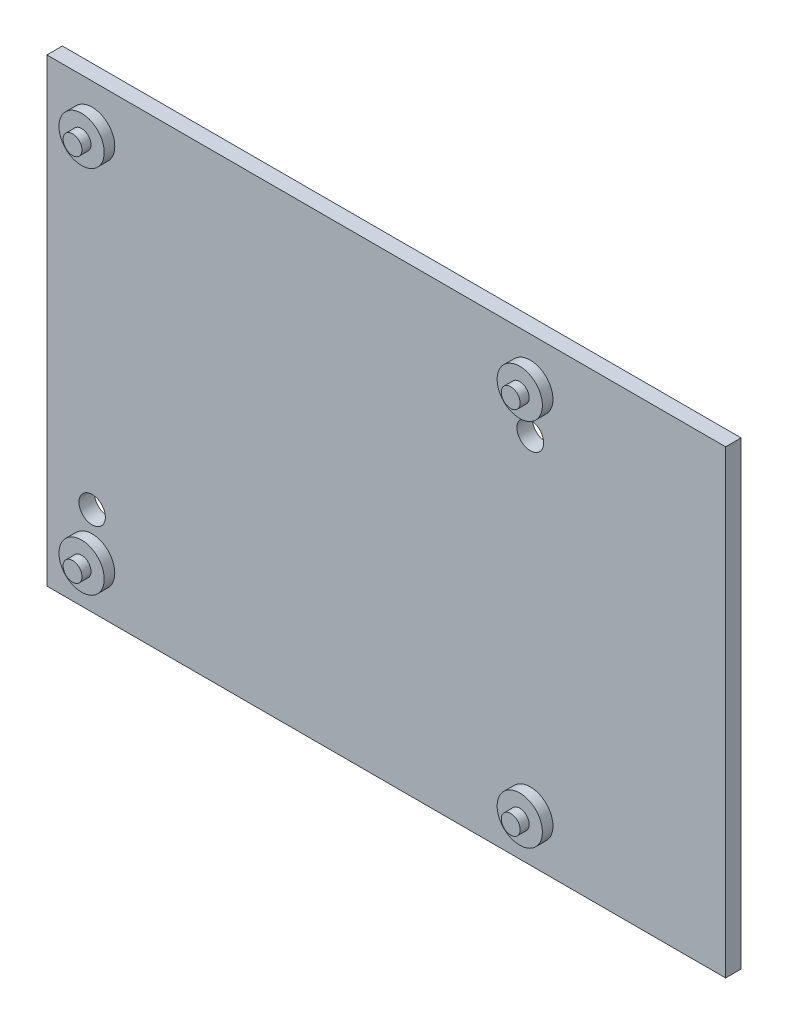
ISO-10303-21;
HEADER;
FILE_DESCRIPTION(('STEP AP214'),'2;1');
FILE_NAME('part.step','',(''),(''),'','','');
FILE_SCHEMA(('AUTOMOTIVE_DESIGN { 1 0 10303 214 1 1 1 1 }'));
ENDSEC;
DATA;
#1=APPLICATION_CONTEXT('core data for automotive mechanical design processes');
#2=APPLICATION_PROTOCOL_DEFINITION('international standard','automotive_design',2000,#1);
#3=PRODUCT_CONTEXT('',#1,'mechanical');
#4=PRODUCT('Part','Part','',(#3));
#5=PRODUCT_RELATED_PRODUCT_CATEGORY('part','',(#4));
#6=PRODUCT_DEFINITION_FORMATION('','',#4);
#7=PRODUCT_DEFINITION_CONTEXT('part definition',#1,'design');
#8=PRODUCT_DEFINITION('design','',#6,#7);
#9=PRODUCT_DEFINITION_SHAPE('','',#8);
#10=(LENGTH_UNIT() NAMED_UNIT(*) SI_UNIT(.MILLI.,.METRE.));
#11=(NAMED_UNIT(*) PLANE_ANGLE_UNIT() SI_UNIT($,.RADIAN.));
#12=(NAMED_UNIT(*) SI_UNIT($,.STERADIAN.) SOLID_ANGLE_UNIT());
#13=UNCERTAINTY_MEASURE_WITH_UNIT(LENGTH_MEASURE(1.E-05),#10,'distance_accuracy_value','');
#14=(GEOMETRIC_REPRESENTATION_CONTEXT(3) GLOBAL_UNCERTAINTY_ASSIGNED_CONTEXT((#13)) GLOBAL_UNIT_ASSIGNED_CONTEXT((#10,
#11,#12)) REPRESENTATION_CONTEXT('',''));
#15=CARTESIAN_POINT('',(0.,0.,0.));
#16=DIRECTION('',(0.,0.,1.));
#17=DIRECTION('',(1.,0.,0.));
#18=AXIS2_PLACEMENT_3D('',#15,#16,#17);
#19=CARTESIAN_POINT('',(45.,-30.5,-2.05));
#20=DIRECTION('',(1.,0.,0.));
#21=DIRECTION('',(0.,0.,-1.));
#22=AXIS2_PLACEMENT_3D('',#19,#20,#21);
#23=PLANE('',#22);
#24=DIRECTION('',(0.,1.,0.));
#25=VECTOR('',#24,1.);
#26=CARTESIAN_POINT('',(45.,-30.5,0.));
#27=LINE('',#26,#25);
#28=CARTESIAN_POINT('',(45.,-30.5,0.));
#29=VERTEX_POINT('',#28);
#30=CARTESIAN_POINT('',(45.,30.5,0.));
#31=VERTEX_POINT('',#30);
#32=EDGE_CURVE('E120',#29,#31,#27,.T.);
#33=ORIENTED_EDGE('',*,*,#32,.F.);
#34=DIRECTION('',(0.,0.,1.));
#35=VECTOR('',#34,1.);
#36=CARTESIAN_POINT('',(45.,-30.5,-2.05));
#37=LINE('',#36,#35);
#38=CARTESIAN_POINT('',(45.,-30.5,-2.05));
#39=VERTEX_POINT('',#38);
#40=EDGE_CURVE('E11',#39,#29,#37,.T.);
#41=ORIENTED_EDGE('',*,*,#40,.F.);
#42=DIRECTION('',(0.,1.,0.));
#43=VECTOR('',#42,1.);
#44=CARTESIAN_POINT('',(45.,-30.5,-2.05));
#45=LINE('',#44,#43);
#46=CARTESIAN_POINT('',(45.,30.5,-2.05));
#47=VERTEX_POINT('',#46);
#48=EDGE_CURVE('E112',#39,#47,#45,.T.);
#49=ORIENTED_EDGE('',*,*,#48,.T.);
#50=DIRECTION('',(0.,0.,1.));
#51=VECTOR('',#50,1.);
#52=CARTESIAN_POINT('',(45.,30.5,-2.05));
#53=LINE('',#52,#51);
#54=EDGE_CURVE('E93',#47,#31,#53,.T.);
#55=ORIENTED_EDGE('',*,*,#54,.T.);
#56=EDGE_LOOP('',(#33,#41,#49,#55));
#57=FACE_BOUND('',#56,.T.);
#58=ADVANCED_FACE('F50',(#57),#23,.T.);
#59=CARTESIAN_POINT('',(-45.,-30.5,-2.05));
#60=DIRECTION('',(0.,-1.,0.));
#61=DIRECTION('',(0.,0.,-1.));
#62=AXIS2_PLACEMENT_3D('',#59,#60,#61);
#63=PLANE('',#62);
#64=DIRECTION('',(1.,0.,0.));
#65=VECTOR('',#64,1.);
#66=CARTESIAN_POINT('',(-45.,-30.5,0.));
#67=LINE('',#66,#65);
#68=CARTESIAN_POINT('',(-45.,-30.5,0.));
#69=VERTEX_POINT('',#68);
#70=EDGE_CURVE('E111',#69,#29,#67,.T.);
#71=ORIENTED_EDGE('',*,*,#70,.F.);
#72=DIRECTION('',(0.,0.,1.));
#73=VECTOR('',#72,1.);
#74=CARTESIAN_POINT('',(-45.,-30.5,-2.05));
#75=LINE('',#74,#73);
#76=CARTESIAN_POINT('',(-45.,-30.5,-2.05));
#77=VERTEX_POINT('',#76);
#78=EDGE_CURVE('E60',#77,#69,#75,.T.);
#79=ORIENTED_EDGE('',*,*,#78,.F.);
#80=DIRECTION('',(1.,0.,0.));
#81=VECTOR('',#80,1.);
#82=CARTESIAN_POINT('',(-45.,-30.5,-2.05));
#83=LINE('',#82,#81);
#84=EDGE_CURVE('E106',#77,#39,#83,.T.);
#85=ORIENTED_EDGE('',*,*,#84,.T.);
#86=ORIENTED_EDGE('',*,*,#40,.T.);
#87=EDGE_LOOP('',(#71,#79,#85,#86));
#88=FACE_BOUND('',#87,.T.);
#89=ADVANCED_FACE('F240',(#88),#63,.T.);
#90=CARTESIAN_POINT('',(-45.,-30.5,-2.05));
#91=DIRECTION('',(-1.,0.,0.));
#92=DIRECTION('',(0.,0.,1.));
#93=AXIS2_PLACEMENT_3D('',#90,#91,#92);
#94=PLANE('',#93);
#95=DIRECTION('',(0.,-1.,0.));
#96=VECTOR('',#95,1.);
#97=CARTESIAN_POINT('',(-45.,-30.5,0.));
#98=LINE('',#97,#96);
#99=CARTESIAN_POINT('',(-45.,30.5,0.));
#100=VERTEX_POINT('',#99);
#101=EDGE_CURVE('E97',#100,#69,#98,.T.);
#102=ORIENTED_EDGE('',*,*,#101,.F.);
#103=DIRECTION('',(0.,0.,1.));
#104=VECTOR('',#103,1.);
#105=CARTESIAN_POINT('',(-45.,30.5,-2.05));
#106=LINE('',#105,#104);
#107=CARTESIAN_POINT('',(-45.,30.5,-2.05));
#108=VERTEX_POINT('',#107);
#109=EDGE_CURVE('E94',#108,#100,#106,.T.);
#110=ORIENTED_EDGE('',*,*,#109,.F.);
#111=DIRECTION('',(0.,-1.,0.));
#112=VECTOR('',#111,1.);
#113=CARTESIAN_POINT('',(-45.,-30.5,-2.05));
#114=LINE('',#113,#112);
#115=EDGE_CURVE('E100',#108,#77,#114,.T.);
#116=ORIENTED_EDGE('',*,*,#115,.T.);
#117=ORIENTED_EDGE('',*,*,#78,.T.);
#118=EDGE_LOOP('',(#102,#110,#116,#117));
#119=FACE_BOUND('',#118,.T.);
#120=ADVANCED_FACE('F96',(#119),#94,.T.);
#121=CARTESIAN_POINT('',(-45.,30.5,-2.05));
#122=DIRECTION('',(0.,1.,0.));
#123=DIRECTION('',(0.,0.,1.));
#124=AXIS2_PLACEMENT_3D('',#121,#122,#123);
#125=PLANE('',#124);
#126=DIRECTION('',(-1.,0.,0.));
#127=VECTOR('',#126,1.);
#128=CARTESIAN_POINT('',(-45.,30.5,0.));
#129=LINE('',#128,#127);
#130=EDGE_CURVE('E122',#31,#100,#129,.T.);
#131=ORIENTED_EDGE('',*,*,#130,.F.);
#132=ORIENTED_EDGE('',*,*,#54,.F.);
#133=DIRECTION('',(-1.,0.,0.));
#134=VECTOR('',#133,1.);
#135=CARTESIAN_POINT('',(-45.,30.5,-2.05));
#136=LINE('',#135,#134);
#137=EDGE_CURVE('E104',#47,#108,#136,.T.);
#138=ORIENTED_EDGE('',*,*,#137,.T.);
#139=ORIENTED_EDGE('',*,*,#109,.T.);
#140=EDGE_LOOP('',(#131,#132,#138,#139));
#141=FACE_BOUND('',#140,.T.);
#142=ADVANCED_FACE('F108',(#141),#125,.T.);
#143=CARTESIAN_POINT('',(0.,0.,-2.05));
#144=DIRECTION('',(0.,0.,-1.));
#145=DIRECTION('',(-1.,0.,0.));
#146=AXIS2_PLACEMENT_3D('',#143,#144,#145);
#147=PLANE('',#146);
#148=CARTESIAN_POINT('',(19.1,18.86871886,-2.05));
#149=DIRECTION('',(0.,0.,-1.));
#150=DIRECTION('',(-1.,0.,0.));
#151=AXIS2_PLACEMENT_3D('',#148,#149,#150);
#152=CIRCLE('',#151,1.775);
#153=CARTESIAN_POINT('',(17.325,18.86871886,-2.05));
#154=VERTEX_POINT('',#153);
#155=EDGE_CURVE('E164',#154,#154,#152,.T.);
#156=ORIENTED_EDGE('',*,*,#155,.F.);
#157=EDGE_LOOP('',(#156));
#158=FACE_BOUND('',#157,.T.);
#159=CARTESIAN_POINT('',(-39.,-18.72,-2.05));
#160=DIRECTION('',(0.,0.,-1.));
#161=DIRECTION('',(-1.,0.,0.));
#162=AXIS2_PLACEMENT_3D('',#159,#160,#161);
#163=CIRCLE('',#162,1.75);
#164=CARTESIAN_POINT('',(-40.75,-18.72,-2.05));
#165=VERTEX_POINT('',#164);
#166=EDGE_CURVE('E154',#165,#165,#163,.T.);
#167=ORIENTED_EDGE('',*,*,#166,.F.);
#168=EDGE_LOOP('',(#167));
#169=FACE_BOUND('',#168,.T.);
#170=ORIENTED_EDGE('',*,*,#48,.F.);
#171=ORIENTED_EDGE('',*,*,#84,.F.);
#172=ORIENTED_EDGE('',*,*,#115,.F.);
#173=ORIENTED_EDGE('',*,*,#137,.F.);
#174=EDGE_LOOP('',(#170,#171,#172,#173));
#175=FACE_BOUND('',#174,.T.);
#176=ADVANCED_FACE('F102',(#158,#169,#175),#147,.T.);
#177=CARTESIAN_POINT('',(0.,0.,0.));
#178=DIRECTION('',(0.,0.,-1.));
#179=DIRECTION('',(-1.,0.,0.));
#180=AXIS2_PLACEMENT_3D('',#177,#178,#179);
#181=PLANE('',#180);
#182=CARTESIAN_POINT('',(19.1,18.86871886,0.));
#183=DIRECTION('',(0.,0.,-1.));
#184=DIRECTION('',(-1.,0.,0.));
#185=AXIS2_PLACEMENT_3D('',#182,#183,#184);
#186=CIRCLE('',#185,1.775);
#187=CARTESIAN_POINT('',(17.325,18.86871886,0.));
#188=VERTEX_POINT('',#187);
#189=EDGE_CURVE('E49',#188,#188,#186,.T.);
#190=ORIENTED_EDGE('',*,*,#189,.T.);
#191=EDGE_LOOP('',(#190));
#192=FACE_BOUND('',#191,.T.);
#193=CARTESIAN_POINT('',(-39.,-18.72,0.));
#194=DIRECTION('',(0.,0.,-1.));
#195=DIRECTION('',(-1.,0.,0.));
#196=AXIS2_PLACEMENT_3D('',#193,#194,#195);
#197=CIRCLE('',#196,1.75);
#198=CARTESIAN_POINT('',(-40.75,-18.72,0.));
#199=VERTEX_POINT('',#198);
#200=EDGE_CURVE('E155',#199,#199,#197,.T.);
#201=ORIENTED_EDGE('',*,*,#200,.T.);
#202=EDGE_LOOP('',(#201));
#203=FACE_BOUND('',#202,.T.);
#204=CARTESIAN_POINT('',(-39.,-24.5,0.));
#205=DIRECTION('',(0.,0.,-1.));
#206=DIRECTION('',(-1.,0.,0.));
#207=AXIS2_PLACEMENT_3D('',#204,#205,#206);
#208=CIRCLE('',#207,3.);
#209=CARTESIAN_POINT('',(-42.,-24.5,0.));
#210=VERTEX_POINT('',#209);
#211=EDGE_CURVE('E124',#210,#210,#208,.T.);
#212=ORIENTED_EDGE('',*,*,#211,.T.);
#213=EDGE_LOOP('',(#212));
#214=FACE_BOUND('',#213,.T.);
#215=CARTESIAN_POINT('',(19.1,-24.5,0.));
#216=DIRECTION('',(0.,0.,-1.));
#217=DIRECTION('',(-1.,0.,0.));
#218=AXIS2_PLACEMENT_3D('',#215,#216,#217);
#219=CIRCLE('',#218,3.);
#220=CARTESIAN_POINT('',(16.1,-24.5,0.));
#221=VERTEX_POINT('',#220);
#222=EDGE_CURVE('E148',#221,#221,#219,.T.);
#223=ORIENTED_EDGE('',*,*,#222,.T.);
#224=EDGE_LOOP('',(#223));
#225=FACE_BOUND('',#224,.T.);
#226=CARTESIAN_POINT('',(19.1,24.5,0.));
#227=DIRECTION('',(0.,0.,-1.));
#228=DIRECTION('',(-1.,0.,0.));
#229=AXIS2_PLACEMENT_3D('',#226,#227,#228);
#230=CIRCLE('',#229,3.);
#231=CARTESIAN_POINT('',(16.1,24.5,0.));
#232=VERTEX_POINT('',#231);
#233=EDGE_CURVE('E143',#232,#232,#230,.T.);
#234=ORIENTED_EDGE('',*,*,#233,.T.);
#235=EDGE_LOOP('',(#234));
#236=FACE_BOUND('',#235,.T.);
#237=CARTESIAN_POINT('',(-39.,24.5,0.));
#238=DIRECTION('',(0.,0.,-1.));
#239=DIRECTION('',(-1.,0.,0.));
#240=AXIS2_PLACEMENT_3D('',#237,#238,#239);
#241=CIRCLE('',#240,3.);
#242=CARTESIAN_POINT('',(-42.,24.5,0.));
#243=VERTEX_POINT('',#242);
#244=EDGE_CURVE('E140',#243,#243,#241,.T.);
#245=ORIENTED_EDGE('',*,*,#244,.T.);
#246=EDGE_LOOP('',(#245));
#247=FACE_BOUND('',#246,.T.);
#248=ORIENTED_EDGE('',*,*,#32,.T.);
#249=ORIENTED_EDGE('',*,*,#130,.T.);
#250=ORIENTED_EDGE('',*,*,#101,.T.);
#251=ORIENTED_EDGE('',*,*,#70,.T.);
#252=EDGE_LOOP('',(#248,#249,#250,#251));
#253=FACE_BOUND('',#252,.T.);
#254=ADVANCED_FACE('F228',(#192,#203,#214,#225,#236,#247,#253),#181,.F.);
#255=CARTESIAN_POINT('',(-39.,24.5,-0.5));
#256=DIRECTION('',(0.,0.,1.));
#257=DIRECTION('',(1.,0.,0.));
#258=AXIS2_PLACEMENT_3D('',#255,#256,#257);
#259=CYLINDRICAL_SURFACE('',#258,3.);
#260=CARTESIAN_POINT('',(-39.,24.5,1.4));
#261=DIRECTION('',(0.,0.,1.));
#262=DIRECTION('',(1.,0.,0.));
#263=AXIS2_PLACEMENT_3D('',#260,#261,#262);
#264=CIRCLE('',#263,3.);
#265=CARTESIAN_POINT('',(-36.,24.5,1.4));
#266=VERTEX_POINT('',#265);
#267=EDGE_CURVE('E209',#266,#266,#264,.T.);
#268=ORIENTED_EDGE('',*,*,#267,.F.);
#269=EDGE_LOOP('',(#268));
#270=FACE_BOUND('',#269,.T.);
#271=ORIENTED_EDGE('',*,*,#244,.F.);
#272=EDGE_LOOP('',(#271));
#273=FACE_BOUND('',#272,.T.);
#274=ADVANCED_FACE('F224',(#270,#273),#259,.T.);
#275=CARTESIAN_POINT('',(-39.,24.5,1.4));
#276=DIRECTION('',(0.,0.,1.));
#277=DIRECTION('',(1.,0.,0.));
#278=AXIS2_PLACEMENT_3D('',#275,#276,#277);
#279=PLANE('',#278);
#280=CARTESIAN_POINT('',(-39.,24.5,1.4));
#281=DIRECTION('',(0.,0.,1.));
#282=DIRECTION('',(1.,0.,0.));
#283=AXIS2_PLACEMENT_3D('',#280,#281,#282);
#284=CIRCLE('',#283,1.25);
#285=CARTESIAN_POINT('',(-37.75,24.5,1.4));
#286=VERTEX_POINT('',#285);
#287=EDGE_CURVE('E142',#286,#286,#284,.T.);
#288=ORIENTED_EDGE('',*,*,#287,.F.);
#289=EDGE_LOOP('',(#288));
#290=FACE_BOUND('',#289,.T.);
#291=ORIENTED_EDGE('',*,*,#267,.T.);
#292=EDGE_LOOP('',(#291));
#293=FACE_BOUND('',#292,.T.);
#294=ADVANCED_FACE('F219',(#290,#293),#279,.T.);
#295=CARTESIAN_POINT('',(-39.,24.5,-0.5));
#296=DIRECTION('',(0.,0.,1.));
#297=DIRECTION('',(1.,0.,0.));
#298=AXIS2_PLACEMENT_3D('',#295,#296,#297);
#299=CYLINDRICAL_SURFACE('',#298,1.25);
#300=ORIENTED_EDGE('',*,*,#287,.T.);
#301=EDGE_LOOP('',(#300));
#302=FACE_BOUND('',#301,.T.);
#303=CARTESIAN_POINT('',(-39.,24.5,2.6));
#304=DIRECTION('',(0.,0.,1.));
#305=DIRECTION('',(1.,0.,0.));
#306=AXIS2_PLACEMENT_3D('',#303,#304,#305);
#307=CIRCLE('',#306,1.25);
#308=CARTESIAN_POINT('',(-37.75,24.5,2.6));
#309=VERTEX_POINT('',#308);
#310=EDGE_CURVE('E184',#309,#309,#307,.T.);
#311=ORIENTED_EDGE('',*,*,#310,.F.);
#312=EDGE_LOOP('',(#311));
#313=FACE_BOUND('',#312,.T.);
#314=ADVANCED_FACE('F220',(#302,#313),#299,.T.);
#315=CARTESIAN_POINT('',(-39.,24.5,2.6));
#316=DIRECTION('',(0.,0.,1.));
#317=DIRECTION('',(1.,0.,0.));
#318=AXIS2_PLACEMENT_3D('',#315,#316,#317);
#319=PLANE('',#318);
#320=ORIENTED_EDGE('',*,*,#310,.T.);
#321=EDGE_LOOP('',(#320));
#322=FACE_BOUND('',#321,.T.);
#323=ADVANCED_FACE('F257',(#322),#319,.T.);
#324=CARTESIAN_POINT('',(19.1,24.5,-0.5));
#325=DIRECTION('',(0.,0.,1.));
#326=DIRECTION('',(1.,0.,0.));
#327=AXIS2_PLACEMENT_3D('',#324,#325,#326);
#328=CYLINDRICAL_SURFACE('',#327,3.);
#329=CARTESIAN_POINT('',(19.1,24.5,1.4));
#330=DIRECTION('',(0.,0.,1.));
#331=DIRECTION('',(1.,0.,0.));
#332=AXIS2_PLACEMENT_3D('',#329,#330,#331);
#333=CIRCLE('',#332,3.);
#334=CARTESIAN_POINT('',(22.1,24.5,1.4));
#335=VERTEX_POINT('',#334);
#336=EDGE_CURVE('E175',#335,#335,#333,.T.);
#337=ORIENTED_EDGE('',*,*,#336,.F.);
#338=EDGE_LOOP('',(#337));
#339=FACE_BOUND('',#338,.T.);
#340=ORIENTED_EDGE('',*,*,#233,.F.);
#341=EDGE_LOOP('',(#340));
#342=FACE_BOUND('',#341,.T.);
#343=ADVANCED_FACE('F263',(#339,#342),#328,.T.);
#344=CARTESIAN_POINT('',(19.1,24.5,1.4));
#345=DIRECTION('',(0.,0.,1.));
#346=DIRECTION('',(1.,0.,0.));
#347=AXIS2_PLACEMENT_3D('',#344,#345,#346);
#348=PLANE('',#347);
#349=CARTESIAN_POINT('',(19.1,24.5,1.4));
#350=DIRECTION('',(0.,0.,1.));
#351=DIRECTION('',(1.,0.,0.));
#352=AXIS2_PLACEMENT_3D('',#349,#350,#351);
#353=CIRCLE('',#352,1.25);
#354=CARTESIAN_POINT('',(20.35,24.5,1.4));
#355=VERTEX_POINT('',#354);
#356=EDGE_CURVE('E179',#355,#355,#353,.T.);
#357=ORIENTED_EDGE('',*,*,#356,.F.);
#358=EDGE_LOOP('',(#357));
#359=FACE_BOUND('',#358,.T.);
#360=ORIENTED_EDGE('',*,*,#336,.T.);
#361=EDGE_LOOP('',(#360));
#362=FACE_BOUND('',#361,.T.);
#363=ADVANCED_FACE('F298',(#359,#362),#348,.T.);
#364=CARTESIAN_POINT('',(19.1,24.5,-0.5));
#365=DIRECTION('',(0.,0.,1.));
#366=DIRECTION('',(1.,0.,0.));
#367=AXIS2_PLACEMENT_3D('',#364,#365,#366);
#368=CYLINDRICAL_SURFACE('',#367,1.25);
#369=ORIENTED_EDGE('',*,*,#356,.T.);
#370=EDGE_LOOP('',(#369));
#371=FACE_BOUND('',#370,.T.);
#372=CARTESIAN_POINT('',(19.1,24.5,2.6));
#373=DIRECTION('',(0.,0.,1.));
#374=DIRECTION('',(1.,0.,0.));
#375=AXIS2_PLACEMENT_3D('',#372,#373,#374);
#376=CIRCLE('',#375,1.25);
#377=CARTESIAN_POINT('',(20.35,24.5,2.6));
#378=VERTEX_POINT('',#377);
#379=EDGE_CURVE('E171',#378,#378,#376,.T.);
#380=ORIENTED_EDGE('',*,*,#379,.F.);
#381=EDGE_LOOP('',(#380));
#382=FACE_BOUND('',#381,.T.);
#383=ADVANCED_FACE('F305',(#371,#382),#368,.T.);
#384=CARTESIAN_POINT('',(19.1,24.5,2.6));
#385=DIRECTION('',(0.,0.,1.));
#386=DIRECTION('',(1.,0.,0.));
#387=AXIS2_PLACEMENT_3D('',#384,#385,#386);
#388=PLANE('',#387);
#389=ORIENTED_EDGE('',*,*,#379,.T.);
#390=EDGE_LOOP('',(#389));
#391=FACE_BOUND('',#390,.T.);
#392=ADVANCED_FACE('F292',(#391),#388,.T.);
#393=CARTESIAN_POINT('',(19.1,-24.5,-0.5));
#394=DIRECTION('',(0.,0.,1.));
#395=DIRECTION('',(1.,0.,0.));
#396=AXIS2_PLACEMENT_3D('',#393,#394,#395);
#397=CYLINDRICAL_SURFACE('',#396,3.);
#398=CARTESIAN_POINT('',(19.1,-24.5,1.4));
#399=DIRECTION('',(0.,0.,1.));
#400=DIRECTION('',(1.,0.,0.));
#401=AXIS2_PLACEMENT_3D('',#398,#399,#400);
#402=CIRCLE('',#401,3.);
#403=CARTESIAN_POINT('',(22.1,-24.5,1.4));
#404=VERTEX_POINT('',#403);
#405=EDGE_CURVE('E188',#404,#404,#402,.T.);
#406=ORIENTED_EDGE('',*,*,#405,.F.);
#407=EDGE_LOOP('',(#406));
#408=FACE_BOUND('',#407,.T.);
#409=ORIENTED_EDGE('',*,*,#222,.F.);
#410=EDGE_LOOP('',(#409));
#411=FACE_BOUND('',#410,.T.);
#412=ADVANCED_FACE('F290',(#408,#411),#397,.T.);
#413=CARTESIAN_POINT('',(19.1,-24.5,1.4));
#414=DIRECTION('',(0.,0.,1.));
#415=DIRECTION('',(1.,0.,0.));
#416=AXIS2_PLACEMENT_3D('',#413,#414,#415);
#417=PLANE('',#416);
#418=CARTESIAN_POINT('',(19.1,-24.5,1.4));
#419=DIRECTION('',(0.,0.,1.));
#420=DIRECTION('',(1.,0.,0.));
#421=AXIS2_PLACEMENT_3D('',#418,#419,#420);
#422=CIRCLE('',#421,1.25);
#423=CARTESIAN_POINT('',(20.35,-24.5,1.4));
#424=VERTEX_POINT('',#423);
#425=EDGE_CURVE('E176',#424,#424,#422,.T.);
#426=ORIENTED_EDGE('',*,*,#425,.F.);
#427=EDGE_LOOP('',(#426));
#428=FACE_BOUND('',#427,.T.);
#429=ORIENTED_EDGE('',*,*,#405,.T.);
#430=EDGE_LOOP('',(#429));
#431=FACE_BOUND('',#430,.T.);
#432=ADVANCED_FACE('F284',(#428,#431),#417,.T.);
#433=CARTESIAN_POINT('',(19.1,-24.5,-0.5));
#434=DIRECTION('',(0.,0.,1.));
#435=DIRECTION('',(1.,0.,0.));
#436=AXIS2_PLACEMENT_3D('',#433,#434,#435);
#437=CYLINDRICAL_SURFACE('',#436,1.25);
#438=ORIENTED_EDGE('',*,*,#425,.T.);
#439=EDGE_LOOP('',(#438));
#440=FACE_BOUND('',#439,.T.);
#441=CARTESIAN_POINT('',(19.1,-24.5,2.6));
#442=DIRECTION('',(0.,0.,1.));
#443=DIRECTION('',(1.,0.,0.));
#444=AXIS2_PLACEMENT_3D('',#441,#442,#443);
#445=CIRCLE('',#444,1.25);
#446=CARTESIAN_POINT('',(20.35,-24.5,2.6));
#447=VERTEX_POINT('',#446);
#448=EDGE_CURVE('E183',#447,#447,#445,.T.);
#449=ORIENTED_EDGE('',*,*,#448,.F.);
#450=EDGE_LOOP('',(#449));
#451=FACE_BOUND('',#450,.T.);
#452=ADVANCED_FACE('F286',(#440,#451),#437,.T.);
#453=CARTESIAN_POINT('',(19.1,-24.5,2.6));
#454=DIRECTION('',(0.,0.,1.));
#455=DIRECTION('',(1.,0.,0.));
#456=AXIS2_PLACEMENT_3D('',#453,#454,#455);
#457=PLANE('',#456);
#458=ORIENTED_EDGE('',*,*,#448,.T.);
#459=EDGE_LOOP('',(#458));
#460=FACE_BOUND('',#459,.T.);
#461=ADVANCED_FACE('F272',(#460),#457,.T.);
#462=CARTESIAN_POINT('',(-39.,-24.5,-0.5));
#463=DIRECTION('',(0.,0.,1.));
#464=DIRECTION('',(1.,0.,0.));
#465=AXIS2_PLACEMENT_3D('',#462,#463,#464);
#466=CYLINDRICAL_SURFACE('',#465,3.);
#467=CARTESIAN_POINT('',(-39.,-24.5,1.4));
#468=DIRECTION('',(0.,0.,1.));
#469=DIRECTION('',(1.,0.,0.));
#470=AXIS2_PLACEMENT_3D('',#467,#468,#469);
#471=CIRCLE('',#470,3.);
#472=CARTESIAN_POINT('',(-36.,-24.5,1.4));
#473=VERTEX_POINT('',#472);
#474=EDGE_CURVE('E199',#473,#473,#471,.T.);
#475=ORIENTED_EDGE('',*,*,#474,.F.);
#476=EDGE_LOOP('',(#475));
#477=FACE_BOUND('',#476,.T.);
#478=ORIENTED_EDGE('',*,*,#211,.F.);
#479=EDGE_LOOP('',(#478));
#480=FACE_BOUND('',#479,.T.);
#481=ADVANCED_FACE('F267',(#477,#480),#466,.T.);
#482=CARTESIAN_POINT('',(-39.,-24.5,1.4));
#483=DIRECTION('',(0.,0.,1.));
#484=DIRECTION('',(1.,0.,0.));
#485=AXIS2_PLACEMENT_3D('',#482,#483,#484);
#486=PLANE('',#485);
#487=CARTESIAN_POINT('',(-39.,-24.5,1.4));
#488=DIRECTION('',(0.,0.,1.));
#489=DIRECTION('',(1.,0.,0.));
#490=AXIS2_PLACEMENT_3D('',#487,#488,#489);
#491=CIRCLE('',#490,1.25);
#492=CARTESIAN_POINT('',(-37.75,-24.5,1.4));
#493=VERTEX_POINT('',#492);
#494=EDGE_CURVE('E190',#493,#493,#491,.T.);
#495=ORIENTED_EDGE('',*,*,#494,.F.);
#496=EDGE_LOOP('',(#495));
#497=FACE_BOUND('',#496,.T.);
#498=ORIENTED_EDGE('',*,*,#474,.T.);
#499=EDGE_LOOP('',(#498));
#500=FACE_BOUND('',#499,.T.);
#501=ADVANCED_FACE('F264',(#497,#500),#486,.T.);
#502=CARTESIAN_POINT('',(-39.,-24.5,-0.5));
#503=DIRECTION('',(0.,0.,1.));
#504=DIRECTION('',(1.,0.,0.));
#505=AXIS2_PLACEMENT_3D('',#502,#503,#504);
#506=CYLINDRICAL_SURFACE('',#505,1.25);
#507=ORIENTED_EDGE('',*,*,#494,.T.);
#508=EDGE_LOOP('',(#507));
#509=FACE_BOUND('',#508,.T.);
#510=CARTESIAN_POINT('',(-39.,-24.5,2.6));
#511=DIRECTION('',(0.,0.,1.));
#512=DIRECTION('',(1.,0.,0.));
#513=AXIS2_PLACEMENT_3D('',#510,#511,#512);
#514=CIRCLE('',#513,1.25);
#515=CARTESIAN_POINT('',(-37.75,-24.5,2.6));
#516=VERTEX_POINT('',#515);
#517=EDGE_CURVE('E168',#516,#516,#514,.T.);
#518=ORIENTED_EDGE('',*,*,#517,.F.);
#519=EDGE_LOOP('',(#518));
#520=FACE_BOUND('',#519,.T.);
#521=ADVANCED_FACE('F268',(#509,#520),#506,.T.);
#522=CARTESIAN_POINT('',(-39.,-24.5,2.6));
#523=DIRECTION('',(0.,0.,1.));
#524=DIRECTION('',(1.,0.,0.));
#525=AXIS2_PLACEMENT_3D('',#522,#523,#524);
#526=PLANE('',#525);
#527=ORIENTED_EDGE('',*,*,#517,.T.);
#528=EDGE_LOOP('',(#527));
#529=FACE_BOUND('',#528,.T.);
#530=ADVANCED_FACE('F274',(#529),#526,.T.);
#531=CARTESIAN_POINT('',(-39.,-18.72,-5.));
#532=DIRECTION('',(0.,0.,1.));
#533=DIRECTION('',(1.,0.,0.));
#534=AXIS2_PLACEMENT_3D('',#531,#532,#533);
#535=CYLINDRICAL_SURFACE('',#534,1.75);
#536=ORIENTED_EDGE('',*,*,#166,.T.);
#537=EDGE_LOOP('',(#536));
#538=FACE_BOUND('',#537,.T.);
#539=ORIENTED_EDGE('',*,*,#200,.F.);
#540=EDGE_LOOP('',(#539));
#541=FACE_BOUND('',#540,.T.);
#542=ADVANCED_FACE('F279',(#538,#541),#535,.F.);
#543=CARTESIAN_POINT('',(19.1,18.86871886,-5.));
#544=DIRECTION('',(0.,0.,1.));
#545=DIRECTION('',(1.,0.,0.));
#546=AXIS2_PLACEMENT_3D('',#543,#544,#545);
#547=CYLINDRICAL_SURFACE('',#546,1.775);
#548=ORIENTED_EDGE('',*,*,#155,.T.);
#549=EDGE_LOOP('',(#548));
#550=FACE_BOUND('',#549,.T.);
#551=ORIENTED_EDGE('',*,*,#189,.F.);
#552=EDGE_LOOP('',(#551));
#553=FACE_BOUND('',#552,.T.);
#554=ADVANCED_FACE('F312',(#550,#553),#547,.F.);
#555=CLOSED_SHELL('',(#58,#89,#120,#142,#176,#254,#274,#294,#314,#323,#343,#363,#383,#392,#412,
#432,#452,#461,#481,#501,#521,#530,#542,#554));
#556=MANIFOLD_SOLID_BREP('B2',#555);
#557=ADVANCED_BREP_SHAPE_REPRESENTATION('',(#18,#556),#14);
#558=SHAPE_DEFINITION_REPRESENTATION(#9,#557);
ENDSEC;
END-ISO-10303-21;
